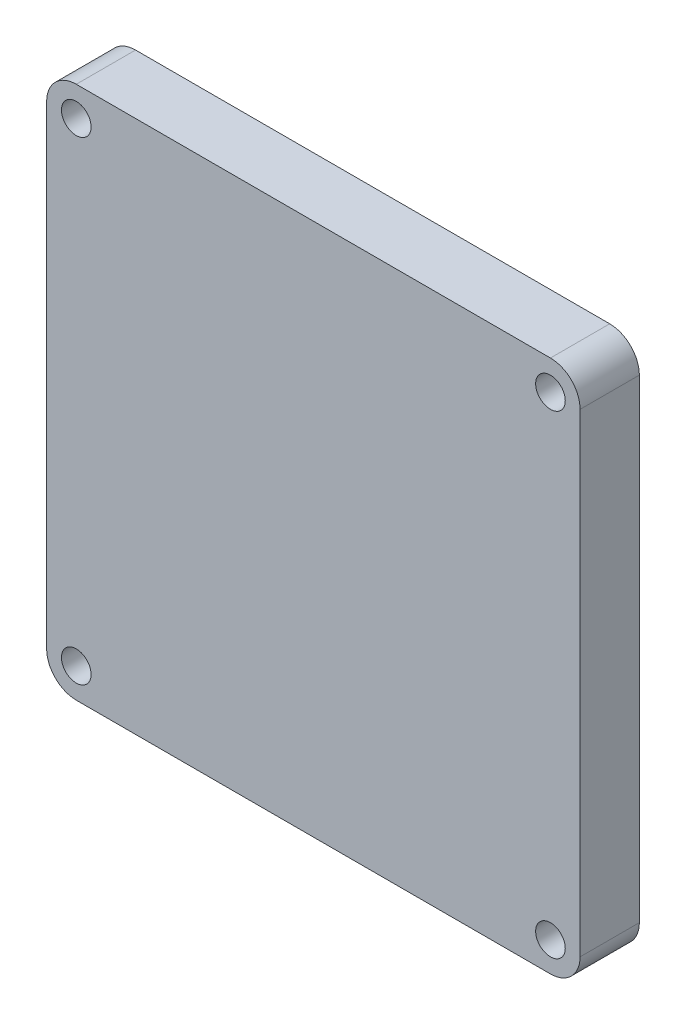
ISO-10303-21;
HEADER;
FILE_DESCRIPTION(('STEP AP214'),'2;1');
FILE_NAME('part.step','',(''),(''),'','','');
FILE_SCHEMA(('AUTOMOTIVE_DESIGN { 1 0 10303 214 1 1 1 1 }'));
ENDSEC;
DATA;
#1=APPLICATION_CONTEXT('core data for automotive mechanical design processes');
#2=APPLICATION_PROTOCOL_DEFINITION('international standard','automotive_design',2000,#1);
#3=PRODUCT_CONTEXT('',#1,'mechanical');
#4=PRODUCT('Part','Part','',(#3));
#5=PRODUCT_RELATED_PRODUCT_CATEGORY('part','',(#4));
#6=PRODUCT_DEFINITION_FORMATION('','',#4);
#7=PRODUCT_DEFINITION_CONTEXT('part definition',#1,'design');
#8=PRODUCT_DEFINITION('design','',#6,#7);
#9=PRODUCT_DEFINITION_SHAPE('','',#8);
#10=(LENGTH_UNIT() NAMED_UNIT(*) SI_UNIT(.MILLI.,.METRE.));
#11=(NAMED_UNIT(*) PLANE_ANGLE_UNIT() SI_UNIT($,.RADIAN.));
#12=(NAMED_UNIT(*) SI_UNIT($,.STERADIAN.) SOLID_ANGLE_UNIT());
#13=UNCERTAINTY_MEASURE_WITH_UNIT(LENGTH_MEASURE(1.E-05),#10,'distance_accuracy_value','');
#14=(GEOMETRIC_REPRESENTATION_CONTEXT(3) GLOBAL_UNCERTAINTY_ASSIGNED_CONTEXT((#13)) GLOBAL_UNIT_ASSIGNED_CONTEXT((#10,
#11,#12)) REPRESENTATION_CONTEXT('',''));
#15=CARTESIAN_POINT('',(0.,0.,0.));
#16=DIRECTION('',(0.,0.,1.));
#17=DIRECTION('',(1.,0.,0.));
#18=AXIS2_PLACEMENT_3D('',#15,#16,#17);
#19=CARTESIAN_POINT('',(45.,45.,10.));
#20=DIRECTION('',(-1.,0.,0.));
#21=DIRECTION('',(0.,-1.,0.));
#22=AXIS2_PLACEMENT_3D('',#19,#20,#21);
#23=PLANE('',#22);
#24=DIRECTION('',(0.,1.,0.));
#25=VECTOR('',#24,1.);
#26=CARTESIAN_POINT('',(45.,45.,10.));
#27=LINE('',#26,#25);
#28=CARTESIAN_POINT('',(45.,-40.,10.));
#29=VERTEX_POINT('',#28);
#30=CARTESIAN_POINT('',(45.,40.,10.));
#31=VERTEX_POINT('',#30);
#32=EDGE_CURVE('E118',#29,#31,#27,.T.);
#33=ORIENTED_EDGE('',*,*,#32,.F.);
#34=DIRECTION('',(0.,0.,-1.));
#35=VECTOR('',#34,1.);
#36=CARTESIAN_POINT('',(45.,-40.,10.));
#37=LINE('',#36,#35);
#38=CARTESIAN_POINT('',(45.,-40.,0.));
#39=VERTEX_POINT('',#38);
#40=EDGE_CURVE('E103',#29,#39,#37,.T.);
#41=ORIENTED_EDGE('',*,*,#40,.T.);
#42=DIRECTION('',(0.,1.,0.));
#43=VECTOR('',#42,1.);
#44=CARTESIAN_POINT('',(45.,45.,0.));
#45=LINE('',#44,#43);
#46=CARTESIAN_POINT('',(45.,40.,0.));
#47=VERTEX_POINT('',#46);
#48=EDGE_CURVE('E115',#39,#47,#45,.T.);
#49=ORIENTED_EDGE('',*,*,#48,.T.);
#50=DIRECTION('',(0.,0.,-1.));
#51=VECTOR('',#50,1.);
#52=CARTESIAN_POINT('',(45.,40.,10.));
#53=LINE('',#52,#51);
#54=EDGE_CURVE('E120',#47,#31,#53,.F.);
#55=ORIENTED_EDGE('',*,*,#54,.T.);
#56=EDGE_LOOP('',(#33,#41,#49,#55));
#57=FACE_BOUND('',#56,.T.);
#58=ADVANCED_FACE('F33',(#57),#23,.F.);
#59=CARTESIAN_POINT('',(-45.,45.,10.));
#60=DIRECTION('',(0.,-1.,0.));
#61=DIRECTION('',(0.,0.,-1.));
#62=AXIS2_PLACEMENT_3D('',#59,#60,#61);
#63=PLANE('',#62);
#64=DIRECTION('',(-1.,0.,0.));
#65=VECTOR('',#64,1.);
#66=CARTESIAN_POINT('',(-45.,45.,0.));
#67=LINE('',#66,#65);
#68=CARTESIAN_POINT('',(40.,45.,0.));
#69=VERTEX_POINT('',#68);
#70=CARTESIAN_POINT('',(-40.,45.,0.));
#71=VERTEX_POINT('',#70);
#72=EDGE_CURVE('E124',#69,#71,#67,.T.);
#73=ORIENTED_EDGE('',*,*,#72,.T.);
#74=DIRECTION('',(0.,0.,-1.));
#75=VECTOR('',#74,1.);
#76=CARTESIAN_POINT('',(-40.,45.,10.));
#77=LINE('',#76,#75);
#78=CARTESIAN_POINT('',(-40.,45.,10.));
#79=VERTEX_POINT('',#78);
#80=EDGE_CURVE('E11',#71,#79,#77,.F.);
#81=ORIENTED_EDGE('',*,*,#80,.T.);
#82=DIRECTION('',(-1.,0.,0.));
#83=VECTOR('',#82,1.);
#84=CARTESIAN_POINT('',(-45.,45.,10.));
#85=LINE('',#84,#83);
#86=CARTESIAN_POINT('',(40.,45.,10.));
#87=VERTEX_POINT('',#86);
#88=EDGE_CURVE('E164',#87,#79,#85,.T.);
#89=ORIENTED_EDGE('',*,*,#88,.F.);
#90=DIRECTION('',(0.,0.,-1.));
#91=VECTOR('',#90,1.);
#92=CARTESIAN_POINT('',(40.,45.,10.));
#93=LINE('',#92,#91);
#94=EDGE_CURVE('E41',#87,#69,#93,.T.);
#95=ORIENTED_EDGE('',*,*,#94,.T.);
#96=EDGE_LOOP('',(#73,#81,#89,#95));
#97=FACE_BOUND('',#96,.T.);
#98=ADVANCED_FACE('F162',(#97),#63,.F.);
#99=CARTESIAN_POINT('',(-45.,45.,10.));
#100=DIRECTION('',(1.,0.,0.));
#101=DIRECTION('',(0.,1.,0.));
#102=AXIS2_PLACEMENT_3D('',#99,#100,#101);
#103=PLANE('',#102);
#104=DIRECTION('',(0.,-1.,0.));
#105=VECTOR('',#104,1.);
#106=CARTESIAN_POINT('',(-45.,45.,0.));
#107=LINE('',#106,#105);
#108=CARTESIAN_POINT('',(-45.,40.,0.));
#109=VERTEX_POINT('',#108);
#110=CARTESIAN_POINT('',(-45.,-40.,0.));
#111=VERTEX_POINT('',#110);
#112=EDGE_CURVE('E128',#109,#111,#107,.T.);
#113=ORIENTED_EDGE('',*,*,#112,.T.);
#114=DIRECTION('',(0.,0.,-1.));
#115=VECTOR('',#114,1.);
#116=CARTESIAN_POINT('',(-45.,-40.,10.));
#117=LINE('',#116,#115);
#118=CARTESIAN_POINT('',(-45.,-40.,10.));
#119=VERTEX_POINT('',#118);
#120=EDGE_CURVE('E48',#111,#119,#117,.F.);
#121=ORIENTED_EDGE('',*,*,#120,.T.);
#122=DIRECTION('',(0.,-1.,0.));
#123=VECTOR('',#122,1.);
#124=CARTESIAN_POINT('',(-45.,45.,10.));
#125=LINE('',#124,#123);
#126=CARTESIAN_POINT('',(-45.,40.,10.));
#127=VERTEX_POINT('',#126);
#128=EDGE_CURVE('E172',#127,#119,#125,.T.);
#129=ORIENTED_EDGE('',*,*,#128,.F.);
#130=DIRECTION('',(0.,0.,-1.));
#131=VECTOR('',#130,1.);
#132=CARTESIAN_POINT('',(-45.,40.,10.));
#133=LINE('',#132,#131);
#134=EDGE_CURVE('E155',#127,#109,#133,.T.);
#135=ORIENTED_EDGE('',*,*,#134,.T.);
#136=EDGE_LOOP('',(#113,#121,#129,#135));
#137=FACE_BOUND('',#136,.T.);
#138=ADVANCED_FACE('F171',(#137),#103,.F.);
#139=CARTESIAN_POINT('',(-45.,-45.,10.));
#140=DIRECTION('',(0.,1.,0.));
#141=DIRECTION('',(0.,0.,1.));
#142=AXIS2_PLACEMENT_3D('',#139,#140,#141);
#143=PLANE('',#142);
#144=DIRECTION('',(1.,0.,0.));
#145=VECTOR('',#144,1.);
#146=CARTESIAN_POINT('',(-45.,-45.,0.));
#147=LINE('',#146,#145);
#148=CARTESIAN_POINT('',(-40.,-45.,0.));
#149=VERTEX_POINT('',#148);
#150=CARTESIAN_POINT('',(40.,-45.,0.));
#151=VERTEX_POINT('',#150);
#152=EDGE_CURVE('E138',#149,#151,#147,.T.);
#153=ORIENTED_EDGE('',*,*,#152,.T.);
#154=DIRECTION('',(0.,0.,-1.));
#155=VECTOR('',#154,1.);
#156=CARTESIAN_POINT('',(40.,-45.,10.));
#157=LINE('',#156,#155);
#158=CARTESIAN_POINT('',(40.,-45.,10.));
#159=VERTEX_POINT('',#158);
#160=EDGE_CURVE('E104',#151,#159,#157,.F.);
#161=ORIENTED_EDGE('',*,*,#160,.T.);
#162=DIRECTION('',(1.,0.,0.));
#163=VECTOR('',#162,1.);
#164=CARTESIAN_POINT('',(-45.,-45.,10.));
#165=LINE('',#164,#163);
#166=CARTESIAN_POINT('',(-40.,-45.,10.));
#167=VERTEX_POINT('',#166);
#168=EDGE_CURVE('E134',#167,#159,#165,.T.);
#169=ORIENTED_EDGE('',*,*,#168,.F.);
#170=DIRECTION('',(0.,0.,-1.));
#171=VECTOR('',#170,1.);
#172=CARTESIAN_POINT('',(-40.,-45.,10.));
#173=LINE('',#172,#171);
#174=EDGE_CURVE('E109',#167,#149,#173,.T.);
#175=ORIENTED_EDGE('',*,*,#174,.T.);
#176=EDGE_LOOP('',(#153,#161,#169,#175));
#177=FACE_BOUND('',#176,.T.);
#178=ADVANCED_FACE('F212',(#177),#143,.F.);
#179=CARTESIAN_POINT('',(0.,0.,10.));
#180=DIRECTION('',(0.,0.,1.));
#181=DIRECTION('',(1.,0.,0.));
#182=AXIS2_PLACEMENT_3D('',#179,#180,#181);
#183=PLANE('',#182);
#184=CARTESIAN_POINT('',(-40.,-40.,10.));
#185=DIRECTION('',(0.,0.,1.));
#186=DIRECTION('',(1.,0.,0.));
#187=AXIS2_PLACEMENT_3D('',#184,#185,#186);
#188=CIRCLE('',#187,2.5);
#189=CARTESIAN_POINT('',(-37.5,-40.,10.));
#190=VERTEX_POINT('',#189);
#191=EDGE_CURVE('E181',#190,#190,#188,.T.);
#192=ORIENTED_EDGE('',*,*,#191,.F.);
#193=EDGE_LOOP('',(#192));
#194=FACE_BOUND('',#193,.T.);
#195=CARTESIAN_POINT('',(40.,-40.,10.));
#196=DIRECTION('',(0.,0.,1.));
#197=DIRECTION('',(1.,0.,0.));
#198=AXIS2_PLACEMENT_3D('',#195,#196,#197);
#199=CIRCLE('',#198,2.5);
#200=CARTESIAN_POINT('',(42.5,-40.,10.));
#201=VERTEX_POINT('',#200);
#202=EDGE_CURVE('E187',#201,#201,#199,.T.);
#203=ORIENTED_EDGE('',*,*,#202,.F.);
#204=EDGE_LOOP('',(#203));
#205=FACE_BOUND('',#204,.T.);
#206=CARTESIAN_POINT('',(40.,40.,10.));
#207=DIRECTION('',(0.,0.,1.));
#208=DIRECTION('',(1.,0.,0.));
#209=AXIS2_PLACEMENT_3D('',#206,#207,#208);
#210=CIRCLE('',#209,2.5);
#211=CARTESIAN_POINT('',(42.5,40.,10.));
#212=VERTEX_POINT('',#211);
#213=EDGE_CURVE('E193',#212,#212,#210,.T.);
#214=ORIENTED_EDGE('',*,*,#213,.F.);
#215=EDGE_LOOP('',(#214));
#216=FACE_BOUND('',#215,.T.);
#217=CARTESIAN_POINT('',(-40.,40.,10.));
#218=DIRECTION('',(0.,0.,1.));
#219=DIRECTION('',(1.,0.,0.));
#220=AXIS2_PLACEMENT_3D('',#217,#218,#219);
#221=CIRCLE('',#220,2.5);
#222=CARTESIAN_POINT('',(-37.5,40.,10.));
#223=VERTEX_POINT('',#222);
#224=EDGE_CURVE('E131',#223,#223,#221,.T.);
#225=ORIENTED_EDGE('',*,*,#224,.F.);
#226=EDGE_LOOP('',(#225));
#227=FACE_BOUND('',#226,.T.);
#228=ORIENTED_EDGE('',*,*,#168,.T.);
#229=CARTESIAN_POINT('',(40.,-40.,10.));
#230=DIRECTION('',(0.,0.,1.));
#231=DIRECTION('',(1.,0.,0.));
#232=AXIS2_PLACEMENT_3D('',#229,#230,#231);
#233=CIRCLE('',#232,5.);
#234=EDGE_CURVE('E153',#159,#29,#233,.T.);
#235=ORIENTED_EDGE('',*,*,#234,.T.);
#236=ORIENTED_EDGE('',*,*,#32,.T.);
#237=CARTESIAN_POINT('',(40.,40.,10.));
#238=DIRECTION('',(0.,0.,1.));
#239=DIRECTION('',(1.,0.,0.));
#240=AXIS2_PLACEMENT_3D('',#237,#238,#239);
#241=CIRCLE('',#240,5.);
#242=EDGE_CURVE('E148',#31,#87,#241,.T.);
#243=ORIENTED_EDGE('',*,*,#242,.T.);
#244=ORIENTED_EDGE('',*,*,#88,.T.);
#245=CARTESIAN_POINT('',(-40.,40.,10.));
#246=DIRECTION('',(0.,0.,1.));
#247=DIRECTION('',(1.,0.,0.));
#248=AXIS2_PLACEMENT_3D('',#245,#246,#247);
#249=CIRCLE('',#248,5.);
#250=EDGE_CURVE('E55',#79,#127,#249,.T.);
#251=ORIENTED_EDGE('',*,*,#250,.T.);
#252=ORIENTED_EDGE('',*,*,#128,.T.);
#253=CARTESIAN_POINT('',(-40.,-40.,10.));
#254=DIRECTION('',(0.,0.,1.));
#255=DIRECTION('',(1.,0.,0.));
#256=AXIS2_PLACEMENT_3D('',#253,#254,#255);
#257=CIRCLE('',#256,5.);
#258=EDGE_CURVE('E151',#119,#167,#257,.T.);
#259=ORIENTED_EDGE('',*,*,#258,.T.);
#260=EDGE_LOOP('',(#228,#235,#236,#243,#244,#251,#252,#259));
#261=FACE_BOUND('',#260,.T.);
#262=ADVANCED_FACE('F209',(#194,#205,#216,#227,#261),#183,.T.);
#263=CARTESIAN_POINT('',(0.,0.,0.));
#264=DIRECTION('',(0.,0.,1.));
#265=DIRECTION('',(1.,0.,0.));
#266=AXIS2_PLACEMENT_3D('',#263,#264,#265);
#267=PLANE('',#266);
#268=CARTESIAN_POINT('',(-40.,-40.,0.));
#269=DIRECTION('',(0.,0.,1.));
#270=DIRECTION('',(1.,0.,0.));
#271=AXIS2_PLACEMENT_3D('',#268,#269,#270);
#272=CIRCLE('',#271,2.5);
#273=CARTESIAN_POINT('',(-37.5,-40.,0.));
#274=VERTEX_POINT('',#273);
#275=EDGE_CURVE('E184',#274,#274,#272,.T.);
#276=ORIENTED_EDGE('',*,*,#275,.T.);
#277=EDGE_LOOP('',(#276));
#278=FACE_BOUND('',#277,.T.);
#279=CARTESIAN_POINT('',(40.,-40.,0.));
#280=DIRECTION('',(0.,0.,1.));
#281=DIRECTION('',(1.,0.,0.));
#282=AXIS2_PLACEMENT_3D('',#279,#280,#281);
#283=CIRCLE('',#282,2.5);
#284=CARTESIAN_POINT('',(42.5,-40.,0.));
#285=VERTEX_POINT('',#284);
#286=EDGE_CURVE('E190',#285,#285,#283,.T.);
#287=ORIENTED_EDGE('',*,*,#286,.T.);
#288=EDGE_LOOP('',(#287));
#289=FACE_BOUND('',#288,.T.);
#290=CARTESIAN_POINT('',(40.,40.,0.));
#291=DIRECTION('',(0.,0.,1.));
#292=DIRECTION('',(1.,0.,0.));
#293=AXIS2_PLACEMENT_3D('',#290,#291,#292);
#294=CIRCLE('',#293,2.5);
#295=CARTESIAN_POINT('',(42.5,40.,0.));
#296=VERTEX_POINT('',#295);
#297=EDGE_CURVE('E179',#296,#296,#294,.T.);
#298=ORIENTED_EDGE('',*,*,#297,.T.);
#299=EDGE_LOOP('',(#298));
#300=FACE_BOUND('',#299,.T.);
#301=CARTESIAN_POINT('',(-40.,40.,0.));
#302=DIRECTION('',(0.,0.,1.));
#303=DIRECTION('',(1.,0.,0.));
#304=AXIS2_PLACEMENT_3D('',#301,#302,#303);
#305=CIRCLE('',#304,2.5);
#306=CARTESIAN_POINT('',(-37.5,40.,0.));
#307=VERTEX_POINT('',#306);
#308=EDGE_CURVE('E125',#307,#307,#305,.T.);
#309=ORIENTED_EDGE('',*,*,#308,.T.);
#310=EDGE_LOOP('',(#309));
#311=FACE_BOUND('',#310,.T.);
#312=ORIENTED_EDGE('',*,*,#48,.F.);
#313=CARTESIAN_POINT('',(40.,-40.,0.));
#314=DIRECTION('',(0.,0.,1.));
#315=DIRECTION('',(1.,0.,0.));
#316=AXIS2_PLACEMENT_3D('',#313,#314,#315);
#317=CIRCLE('',#316,5.);
#318=EDGE_CURVE('E99',#39,#151,#317,.F.);
#319=ORIENTED_EDGE('',*,*,#318,.T.);
#320=ORIENTED_EDGE('',*,*,#152,.F.);
#321=CARTESIAN_POINT('',(-40.,-40.,0.));
#322=DIRECTION('',(0.,0.,1.));
#323=DIRECTION('',(1.,0.,0.));
#324=AXIS2_PLACEMENT_3D('',#321,#322,#323);
#325=CIRCLE('',#324,5.);
#326=EDGE_CURVE('E110',#149,#111,#325,.F.);
#327=ORIENTED_EDGE('',*,*,#326,.T.);
#328=ORIENTED_EDGE('',*,*,#112,.F.);
#329=CARTESIAN_POINT('',(-40.,40.,0.));
#330=DIRECTION('',(0.,0.,1.));
#331=DIRECTION('',(1.,0.,0.));
#332=AXIS2_PLACEMENT_3D('',#329,#330,#331);
#333=CIRCLE('',#332,5.);
#334=EDGE_CURVE('E142',#109,#71,#333,.F.);
#335=ORIENTED_EDGE('',*,*,#334,.T.);
#336=ORIENTED_EDGE('',*,*,#72,.F.);
#337=CARTESIAN_POINT('',(40.,40.,0.));
#338=DIRECTION('',(0.,0.,1.));
#339=DIRECTION('',(1.,0.,0.));
#340=AXIS2_PLACEMENT_3D('',#337,#338,#339);
#341=CIRCLE('',#340,5.);
#342=EDGE_CURVE('E119',#69,#47,#341,.F.);
#343=ORIENTED_EDGE('',*,*,#342,.T.);
#344=EDGE_LOOP('',(#312,#319,#320,#327,#328,#335,#336,#343));
#345=FACE_BOUND('',#344,.T.);
#346=ADVANCED_FACE('F122',(#278,#289,#300,#311,#345),#267,.F.);
#347=CARTESIAN_POINT('',(40.,-40.,10.));
#348=DIRECTION('',(0.,0.,-1.));
#349=DIRECTION('',(-1.,0.,0.));
#350=AXIS2_PLACEMENT_3D('',#347,#348,#349);
#351=CYLINDRICAL_SURFACE('',#350,5.);
#352=ORIENTED_EDGE('',*,*,#234,.F.);
#353=ORIENTED_EDGE('',*,*,#160,.F.);
#354=ORIENTED_EDGE('',*,*,#318,.F.);
#355=ORIENTED_EDGE('',*,*,#40,.F.);
#356=EDGE_LOOP('',(#352,#353,#354,#355));
#357=FACE_BOUND('',#356,.T.);
#358=ADVANCED_FACE('F102',(#357),#351,.T.);
#359=CARTESIAN_POINT('',(-40.,-40.,10.));
#360=DIRECTION('',(0.,0.,-1.));
#361=DIRECTION('',(-1.,0.,0.));
#362=AXIS2_PLACEMENT_3D('',#359,#360,#361);
#363=CYLINDRICAL_SURFACE('',#362,5.);
#364=ORIENTED_EDGE('',*,*,#258,.F.);
#365=ORIENTED_EDGE('',*,*,#120,.F.);
#366=ORIENTED_EDGE('',*,*,#326,.F.);
#367=ORIENTED_EDGE('',*,*,#174,.F.);
#368=EDGE_LOOP('',(#364,#365,#366,#367));
#369=FACE_BOUND('',#368,.T.);
#370=ADVANCED_FACE('F220',(#369),#363,.T.);
#371=CARTESIAN_POINT('',(-40.,40.,10.));
#372=DIRECTION('',(0.,0.,-1.));
#373=DIRECTION('',(-1.,0.,0.));
#374=AXIS2_PLACEMENT_3D('',#371,#372,#373);
#375=CYLINDRICAL_SURFACE('',#374,5.);
#376=ORIENTED_EDGE('',*,*,#250,.F.);
#377=ORIENTED_EDGE('',*,*,#80,.F.);
#378=ORIENTED_EDGE('',*,*,#334,.F.);
#379=ORIENTED_EDGE('',*,*,#134,.F.);
#380=EDGE_LOOP('',(#376,#377,#378,#379));
#381=FACE_BOUND('',#380,.T.);
#382=ADVANCED_FACE('F170',(#381),#375,.T.);
#383=CARTESIAN_POINT('',(40.,40.,10.));
#384=DIRECTION('',(0.,0.,-1.));
#385=DIRECTION('',(-1.,0.,0.));
#386=AXIS2_PLACEMENT_3D('',#383,#384,#385);
#387=CYLINDRICAL_SURFACE('',#386,5.);
#388=ORIENTED_EDGE('',*,*,#242,.F.);
#389=ORIENTED_EDGE('',*,*,#54,.F.);
#390=ORIENTED_EDGE('',*,*,#342,.F.);
#391=ORIENTED_EDGE('',*,*,#94,.F.);
#392=EDGE_LOOP('',(#388,#389,#390,#391));
#393=FACE_BOUND('',#392,.T.);
#394=ADVANCED_FACE('F35',(#393),#387,.T.);
#395=CARTESIAN_POINT('',(-40.,40.,0.));
#396=DIRECTION('',(0.,0.,1.));
#397=DIRECTION('',(1.,0.,0.));
#398=AXIS2_PLACEMENT_3D('',#395,#396,#397);
#399=CYLINDRICAL_SURFACE('',#398,2.5);
#400=ORIENTED_EDGE('',*,*,#308,.F.);
#401=EDGE_LOOP('',(#400));
#402=FACE_BOUND('',#401,.T.);
#403=ORIENTED_EDGE('',*,*,#224,.T.);
#404=EDGE_LOOP('',(#403));
#405=FACE_BOUND('',#404,.T.);
#406=ADVANCED_FACE('F205',(#402,#405),#399,.F.);
#407=CARTESIAN_POINT('',(40.,40.,0.));
#408=DIRECTION('',(0.,0.,1.));
#409=DIRECTION('',(1.,0.,0.));
#410=AXIS2_PLACEMENT_3D('',#407,#408,#409);
#411=CYLINDRICAL_SURFACE('',#410,2.5);
#412=ORIENTED_EDGE('',*,*,#297,.F.);
#413=EDGE_LOOP('',(#412));
#414=FACE_BOUND('',#413,.T.);
#415=ORIENTED_EDGE('',*,*,#213,.T.);
#416=EDGE_LOOP('',(#415));
#417=FACE_BOUND('',#416,.T.);
#418=ADVANCED_FACE('F201',(#414,#417),#411,.F.);
#419=CARTESIAN_POINT('',(40.,-40.,0.));
#420=DIRECTION('',(0.,0.,1.));
#421=DIRECTION('',(1.,0.,0.));
#422=AXIS2_PLACEMENT_3D('',#419,#420,#421);
#423=CYLINDRICAL_SURFACE('',#422,2.5);
#424=ORIENTED_EDGE('',*,*,#286,.F.);
#425=EDGE_LOOP('',(#424));
#426=FACE_BOUND('',#425,.T.);
#427=ORIENTED_EDGE('',*,*,#202,.T.);
#428=EDGE_LOOP('',(#427));
#429=FACE_BOUND('',#428,.T.);
#430=ADVANCED_FACE('F204',(#426,#429),#423,.F.);
#431=CARTESIAN_POINT('',(-40.,-40.,0.));
#432=DIRECTION('',(0.,0.,1.));
#433=DIRECTION('',(1.,0.,0.));
#434=AXIS2_PLACEMENT_3D('',#431,#432,#433);
#435=CYLINDRICAL_SURFACE('',#434,2.5);
#436=ORIENTED_EDGE('',*,*,#275,.F.);
#437=EDGE_LOOP('',(#436));
#438=FACE_BOUND('',#437,.T.);
#439=ORIENTED_EDGE('',*,*,#191,.T.);
#440=EDGE_LOOP('',(#439));
#441=FACE_BOUND('',#440,.T.);
#442=ADVANCED_FACE('F245',(#438,#441),#435,.F.);
#443=CLOSED_SHELL('',(#58,#98,#138,#178,#262,#346,#358,#370,#382,#394,#406,#418,#430,#442));
#444=MANIFOLD_SOLID_BREP('B2',#443);
#445=ADVANCED_BREP_SHAPE_REPRESENTATION('',(#18,#444),#14);
#446=SHAPE_DEFINITION_REPRESENTATION(#9,#445);
ENDSEC;
END-ISO-10303-21;
